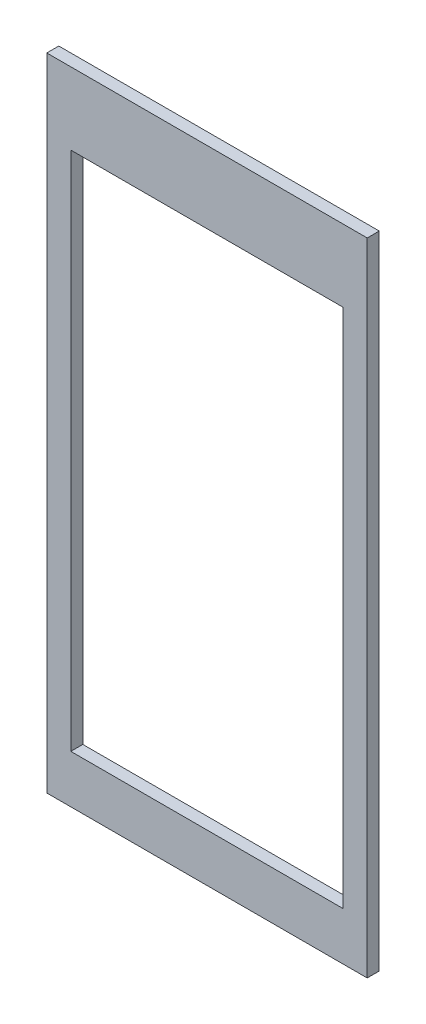
ISO-10303-21;
HEADER;
FILE_DESCRIPTION(('STEP AP214'),'2;1');
FILE_NAME('part.step','',(''),(''),'','','');
FILE_SCHEMA(('AUTOMOTIVE_DESIGN { 1 0 10303 214 1 1 1 1 }'));
ENDSEC;
DATA;
#1=APPLICATION_CONTEXT('core data for automotive mechanical design processes');
#2=APPLICATION_PROTOCOL_DEFINITION('international standard','automotive_design',2000,#1);
#3=PRODUCT_CONTEXT('',#1,'mechanical');
#4=PRODUCT('Part','Part','',(#3));
#5=PRODUCT_RELATED_PRODUCT_CATEGORY('part','',(#4));
#6=PRODUCT_DEFINITION_FORMATION('','',#4);
#7=PRODUCT_DEFINITION_CONTEXT('part definition',#1,'design');
#8=PRODUCT_DEFINITION('design','',#6,#7);
#9=PRODUCT_DEFINITION_SHAPE('','',#8);
#10=(LENGTH_UNIT() NAMED_UNIT(*) SI_UNIT(.MILLI.,.METRE.));
#11=(NAMED_UNIT(*) PLANE_ANGLE_UNIT() SI_UNIT($,.RADIAN.));
#12=(NAMED_UNIT(*) SI_UNIT($,.STERADIAN.) SOLID_ANGLE_UNIT());
#13=UNCERTAINTY_MEASURE_WITH_UNIT(LENGTH_MEASURE(1.E-05),#10,'distance_accuracy_value','');
#14=(GEOMETRIC_REPRESENTATION_CONTEXT(3) GLOBAL_UNCERTAINTY_ASSIGNED_CONTEXT((#13)) GLOBAL_UNIT_ASSIGNED_CONTEXT((#10,
#11,#12)) REPRESENTATION_CONTEXT('',''));
#15=CARTESIAN_POINT('',(0.,0.,0.));
#16=DIRECTION('',(0.,0.,1.));
#17=DIRECTION('',(1.,0.,0.));
#18=AXIS2_PLACEMENT_3D('',#15,#16,#17);
#19=CARTESIAN_POINT('',(0.,0.,1.5));
#20=DIRECTION('',(0.,0.,1.));
#21=DIRECTION('',(1.,0.,0.));
#22=AXIS2_PLACEMENT_3D('',#19,#20,#21);
#23=PLANE('',#22);
#24=DIRECTION('',(1.,0.,0.));
#25=VECTOR('',#24,1.);
#26=CARTESIAN_POINT('',(0.,0.,1.5));
#27=LINE('',#26,#25);
#28=CARTESIAN_POINT('',(0.,0.,1.5));
#29=VERTEX_POINT('',#28);
#30=CARTESIAN_POINT('',(40.,0.,1.5));
#31=VERTEX_POINT('',#30);
#32=EDGE_CURVE('E127',#29,#31,#27,.T.);
#33=ORIENTED_EDGE('',*,*,#32,.T.);
#34=DIRECTION('',(0.,1.,0.));
#35=VECTOR('',#34,1.);
#36=CARTESIAN_POINT('',(40.,0.,1.5));
#37=LINE('',#36,#35);
#38=CARTESIAN_POINT('',(40.,80.,1.5));
#39=VERTEX_POINT('',#38);
#40=EDGE_CURVE('E130',#31,#39,#37,.T.);
#41=ORIENTED_EDGE('',*,*,#40,.T.);
#42=DIRECTION('',(1.,0.,0.));
#43=VECTOR('',#42,1.);
#44=CARTESIAN_POINT('',(0.,80.,1.5));
#45=LINE('',#44,#43);
#46=CARTESIAN_POINT('',(0.,80.,1.5));
#47=VERTEX_POINT('',#46);
#48=EDGE_CURVE('E133',#47,#39,#45,.T.);
#49=ORIENTED_EDGE('',*,*,#48,.F.);
#50=DIRECTION('',(0.,1.,0.));
#51=VECTOR('',#50,1.);
#52=CARTESIAN_POINT('',(0.,0.,1.5));
#53=LINE('',#52,#51);
#54=EDGE_CURVE('E136',#29,#47,#53,.T.);
#55=ORIENTED_EDGE('',*,*,#54,.F.);
#56=EDGE_LOOP('',(#33,#41,#49,#55));
#57=FACE_BOUND('',#56,.T.);
#58=DIRECTION('',(0.,-1.,0.));
#59=VECTOR('',#58,1.);
#60=CARTESIAN_POINT('',(3.00000000000001,0.,1.5));
#61=LINE('',#60,#59);
#62=CARTESIAN_POINT('',(3.,71.,1.5));
#63=VERTEX_POINT('',#62);
#64=CARTESIAN_POINT('',(3.00000000000001,6.,1.5));
#65=VERTEX_POINT('',#64);
#66=EDGE_CURVE('E115',#63,#65,#61,.T.);
#67=ORIENTED_EDGE('',*,*,#66,.F.);
#68=DIRECTION('',(1.,0.,0.));
#69=VECTOR('',#68,1.);
#70=CARTESIAN_POINT('',(0.,71.,1.5));
#71=LINE('',#70,#69);
#72=CARTESIAN_POINT('',(37.,71.,1.5));
#73=VERTEX_POINT('',#72);
#74=EDGE_CURVE('E101',#63,#73,#71,.T.);
#75=ORIENTED_EDGE('',*,*,#74,.T.);
#76=DIRECTION('',(0.,-1.,0.));
#77=VECTOR('',#76,1.);
#78=CARTESIAN_POINT('',(37.,0.,1.5));
#79=LINE('',#78,#77);
#80=CARTESIAN_POINT('',(37.,6.,1.5));
#81=VERTEX_POINT('',#80);
#82=EDGE_CURVE('E109',#73,#81,#79,.T.);
#83=ORIENTED_EDGE('',*,*,#82,.T.);
#84=DIRECTION('',(-1.,0.,0.));
#85=VECTOR('',#84,1.);
#86=CARTESIAN_POINT('',(0.,6.,1.5));
#87=LINE('',#86,#85);
#88=EDGE_CURVE('E48',#81,#65,#87,.T.);
#89=ORIENTED_EDGE('',*,*,#88,.T.);
#90=EDGE_LOOP('',(#67,#75,#83,#89));
#91=FACE_BOUND('',#90,.T.);
#92=ADVANCED_FACE('F33',(#57,#91),#23,.T.);
#93=CARTESIAN_POINT('',(0.,0.,0.));
#94=DIRECTION('',(0.,0.,1.));
#95=DIRECTION('',(1.,0.,0.));
#96=AXIS2_PLACEMENT_3D('',#93,#94,#95);
#97=PLANE('',#96);
#98=DIRECTION('',(1.,0.,0.));
#99=VECTOR('',#98,1.);
#100=CARTESIAN_POINT('',(0.,0.,0.));
#101=LINE('',#100,#99);
#102=CARTESIAN_POINT('',(0.,0.,0.));
#103=VERTEX_POINT('',#102);
#104=CARTESIAN_POINT('',(40.,0.,0.));
#105=VERTEX_POINT('',#104);
#106=EDGE_CURVE('E140',#103,#105,#101,.T.);
#107=ORIENTED_EDGE('',*,*,#106,.F.);
#108=DIRECTION('',(0.,1.,0.));
#109=VECTOR('',#108,1.);
#110=CARTESIAN_POINT('',(0.,0.,0.));
#111=LINE('',#110,#109);
#112=CARTESIAN_POINT('',(0.,80.,0.));
#113=VERTEX_POINT('',#112);
#114=EDGE_CURVE('E131',#103,#113,#111,.T.);
#115=ORIENTED_EDGE('',*,*,#114,.T.);
#116=DIRECTION('',(1.,0.,0.));
#117=VECTOR('',#116,1.);
#118=CARTESIAN_POINT('',(0.,80.,0.));
#119=LINE('',#118,#117);
#120=CARTESIAN_POINT('',(40.,80.,0.));
#121=VERTEX_POINT('',#120);
#122=EDGE_CURVE('E147',#113,#121,#119,.T.);
#123=ORIENTED_EDGE('',*,*,#122,.T.);
#124=DIRECTION('',(0.,1.,0.));
#125=VECTOR('',#124,1.);
#126=CARTESIAN_POINT('',(40.,0.,0.));
#127=LINE('',#126,#125);
#128=EDGE_CURVE('E143',#105,#121,#127,.T.);
#129=ORIENTED_EDGE('',*,*,#128,.F.);
#130=EDGE_LOOP('',(#107,#115,#123,#129));
#131=FACE_BOUND('',#130,.T.);
#132=DIRECTION('',(-1.,0.,0.));
#133=VECTOR('',#132,1.);
#134=CARTESIAN_POINT('',(0.,71.,0.));
#135=LINE('',#134,#133);
#136=CARTESIAN_POINT('',(37.,71.,0.));
#137=VERTEX_POINT('',#136);
#138=CARTESIAN_POINT('',(3.,71.,0.));
#139=VERTEX_POINT('',#138);
#140=EDGE_CURVE('E104',#137,#139,#135,.T.);
#141=ORIENTED_EDGE('',*,*,#140,.T.);
#142=DIRECTION('',(0.,1.,0.));
#143=VECTOR('',#142,1.);
#144=CARTESIAN_POINT('',(3.00000000000001,0.,0.));
#145=LINE('',#144,#143);
#146=CARTESIAN_POINT('',(3.00000000000001,6.,0.));
#147=VERTEX_POINT('',#146);
#148=EDGE_CURVE('E126',#147,#139,#145,.T.);
#149=ORIENTED_EDGE('',*,*,#148,.F.);
#150=DIRECTION('',(1.,0.,0.));
#151=VECTOR('',#150,1.);
#152=CARTESIAN_POINT('',(0.,6.,0.));
#153=LINE('',#152,#151);
#154=CARTESIAN_POINT('',(37.,6.,0.));
#155=VERTEX_POINT('',#154);
#156=EDGE_CURVE('E259',#147,#155,#153,.T.);
#157=ORIENTED_EDGE('',*,*,#156,.T.);
#158=DIRECTION('',(0.,1.,0.));
#159=VECTOR('',#158,1.);
#160=CARTESIAN_POINT('',(37.,0.,0.));
#161=LINE('',#160,#159);
#162=EDGE_CURVE('E144',#155,#137,#161,.T.);
#163=ORIENTED_EDGE('',*,*,#162,.T.);
#164=EDGE_LOOP('',(#141,#149,#157,#163));
#165=FACE_BOUND('',#164,.T.);
#166=ADVANCED_FACE('F164',(#131,#165),#97,.F.);
#167=CARTESIAN_POINT('',(0.,0.,1.5));
#168=DIRECTION('',(0.,1.,0.));
#169=DIRECTION('',(0.,0.,1.));
#170=AXIS2_PLACEMENT_3D('',#167,#168,#169);
#171=PLANE('',#170);
#172=ORIENTED_EDGE('',*,*,#106,.T.);
#173=DIRECTION('',(0.,0.,-1.));
#174=VECTOR('',#173,1.);
#175=CARTESIAN_POINT('',(40.,0.,1.5));
#176=LINE('',#175,#174);
#177=EDGE_CURVE('E11',#31,#105,#176,.T.);
#178=ORIENTED_EDGE('',*,*,#177,.F.);
#179=ORIENTED_EDGE('',*,*,#32,.F.);
#180=DIRECTION('',(0.,0.,-1.));
#181=VECTOR('',#180,1.);
#182=CARTESIAN_POINT('',(0.,0.,1.5));
#183=LINE('',#182,#181);
#184=EDGE_CURVE('E139',#29,#103,#183,.T.);
#185=ORIENTED_EDGE('',*,*,#184,.T.);
#186=EDGE_LOOP('',(#172,#178,#179,#185));
#187=FACE_BOUND('',#186,.T.);
#188=ADVANCED_FACE('F35',(#187),#171,.F.);
#189=CARTESIAN_POINT('',(40.,0.,1.5));
#190=DIRECTION('',(-1.,0.,0.));
#191=DIRECTION('',(0.,0.,1.));
#192=AXIS2_PLACEMENT_3D('',#189,#190,#191);
#193=PLANE('',#192);
#194=ORIENTED_EDGE('',*,*,#128,.T.);
#195=DIRECTION('',(0.,0.,-1.));
#196=VECTOR('',#195,1.);
#197=CARTESIAN_POINT('',(40.,80.,1.5));
#198=LINE('',#197,#196);
#199=EDGE_CURVE('E41',#39,#121,#198,.T.);
#200=ORIENTED_EDGE('',*,*,#199,.F.);
#201=ORIENTED_EDGE('',*,*,#40,.F.);
#202=ORIENTED_EDGE('',*,*,#177,.T.);
#203=EDGE_LOOP('',(#194,#200,#201,#202));
#204=FACE_BOUND('',#203,.T.);
#205=ADVANCED_FACE('F160',(#204),#193,.F.);
#206=CARTESIAN_POINT('',(0.,80.,1.5));
#207=DIRECTION('',(0.,1.,0.));
#208=DIRECTION('',(0.,0.,1.));
#209=AXIS2_PLACEMENT_3D('',#206,#207,#208);
#210=PLANE('',#209);
#211=ORIENTED_EDGE('',*,*,#122,.F.);
#212=DIRECTION('',(0.,0.,-1.));
#213=VECTOR('',#212,1.);
#214=CARTESIAN_POINT('',(0.,80.,1.5));
#215=LINE('',#214,#213);
#216=EDGE_CURVE('E153',#47,#113,#215,.T.);
#217=ORIENTED_EDGE('',*,*,#216,.F.);
#218=ORIENTED_EDGE('',*,*,#48,.T.);
#219=ORIENTED_EDGE('',*,*,#199,.T.);
#220=EDGE_LOOP('',(#211,#217,#218,#219));
#221=FACE_BOUND('',#220,.T.);
#222=ADVANCED_FACE('F157',(#221),#210,.T.);
#223=CARTESIAN_POINT('',(0.,0.,1.5));
#224=DIRECTION('',(-1.,0.,0.));
#225=DIRECTION('',(0.,0.,1.));
#226=AXIS2_PLACEMENT_3D('',#223,#224,#225);
#227=PLANE('',#226);
#228=ORIENTED_EDGE('',*,*,#114,.F.);
#229=ORIENTED_EDGE('',*,*,#184,.F.);
#230=ORIENTED_EDGE('',*,*,#54,.T.);
#231=ORIENTED_EDGE('',*,*,#216,.T.);
#232=EDGE_LOOP('',(#228,#229,#230,#231));
#233=FACE_BOUND('',#232,.T.);
#234=ADVANCED_FACE('F168',(#233),#227,.T.);
#235=CARTESIAN_POINT('',(0.,71.,-73.3552997403732));
#236=DIRECTION('',(0.,-1.,0.));
#237=DIRECTION('',(0.,0.,-1.));
#238=AXIS2_PLACEMENT_3D('',#235,#236,#237);
#239=PLANE('',#238);
#240=DIRECTION('',(0.,0.,1.));
#241=VECTOR('',#240,1.);
#242=CARTESIAN_POINT('',(37.,71.,-73.3552997403732));
#243=LINE('',#242,#241);
#244=EDGE_CURVE('E56',#137,#73,#243,.T.);
#245=ORIENTED_EDGE('',*,*,#244,.T.);
#246=ORIENTED_EDGE('',*,*,#74,.F.);
#247=DIRECTION('',(0.,0.,1.));
#248=VECTOR('',#247,1.);
#249=CARTESIAN_POINT('',(3.,71.,-73.3552997403732));
#250=LINE('',#249,#248);
#251=EDGE_CURVE('E106',#139,#63,#250,.T.);
#252=ORIENTED_EDGE('',*,*,#251,.F.);
#253=ORIENTED_EDGE('',*,*,#140,.F.);
#254=EDGE_LOOP('',(#245,#246,#252,#253));
#255=FACE_BOUND('',#254,.T.);
#256=ADVANCED_FACE('F98',(#255),#239,.T.);
#257=CARTESIAN_POINT('',(3.00000000000001,0.,-73.3552997403732));
#258=DIRECTION('',(-1.,0.,0.));
#259=DIRECTION('',(0.,-1.,0.));
#260=AXIS2_PLACEMENT_3D('',#257,#258,#259);
#261=PLANE('',#260);
#262=ORIENTED_EDGE('',*,*,#148,.T.);
#263=ORIENTED_EDGE('',*,*,#251,.T.);
#264=ORIENTED_EDGE('',*,*,#66,.T.);
#265=DIRECTION('',(0.,0.,1.));
#266=VECTOR('',#265,1.);
#267=CARTESIAN_POINT('',(3.00000000000001,6.,-73.3552997403732));
#268=LINE('',#267,#266);
#269=EDGE_CURVE('E122',#147,#65,#268,.T.);
#270=ORIENTED_EDGE('',*,*,#269,.F.);
#271=EDGE_LOOP('',(#262,#263,#264,#270));
#272=FACE_BOUND('',#271,.T.);
#273=ADVANCED_FACE('F203',(#272),#261,.F.);
#274=CARTESIAN_POINT('',(0.,6.,-73.3552997403732));
#275=DIRECTION('',(0.,1.,0.));
#276=DIRECTION('',(-1.,0.,0.));
#277=AXIS2_PLACEMENT_3D('',#274,#275,#276);
#278=PLANE('',#277);
#279=ORIENTED_EDGE('',*,*,#269,.T.);
#280=ORIENTED_EDGE('',*,*,#88,.F.);
#281=DIRECTION('',(0.,0.,1.));
#282=VECTOR('',#281,1.);
#283=CARTESIAN_POINT('',(37.,6.,-73.3552997403732));
#284=LINE('',#283,#282);
#285=EDGE_CURVE('E111',#155,#81,#284,.T.);
#286=ORIENTED_EDGE('',*,*,#285,.F.);
#287=ORIENTED_EDGE('',*,*,#156,.F.);
#288=EDGE_LOOP('',(#279,#280,#286,#287));
#289=FACE_BOUND('',#288,.T.);
#290=ADVANCED_FACE('F210',(#289),#278,.T.);
#291=CARTESIAN_POINT('',(37.,0.,-73.3552997403732));
#292=DIRECTION('',(-1.,0.,0.));
#293=DIRECTION('',(0.,-1.,0.));
#294=AXIS2_PLACEMENT_3D('',#291,#292,#293);
#295=PLANE('',#294);
#296=ORIENTED_EDGE('',*,*,#285,.T.);
#297=ORIENTED_EDGE('',*,*,#82,.F.);
#298=ORIENTED_EDGE('',*,*,#244,.F.);
#299=ORIENTED_EDGE('',*,*,#162,.F.);
#300=EDGE_LOOP('',(#296,#297,#298,#299));
#301=FACE_BOUND('',#300,.T.);
#302=ADVANCED_FACE('F110',(#301),#295,.T.);
#303=CLOSED_SHELL('',(#92,#166,#188,#205,#222,#234,#256,#273,#290,#302));
#304=MANIFOLD_SOLID_BREP('B2',#303);
#305=ADVANCED_BREP_SHAPE_REPRESENTATION('',(#18,#304),#14);
#306=SHAPE_DEFINITION_REPRESENTATION(#9,#305);
ENDSEC;
END-ISO-10303-21;
